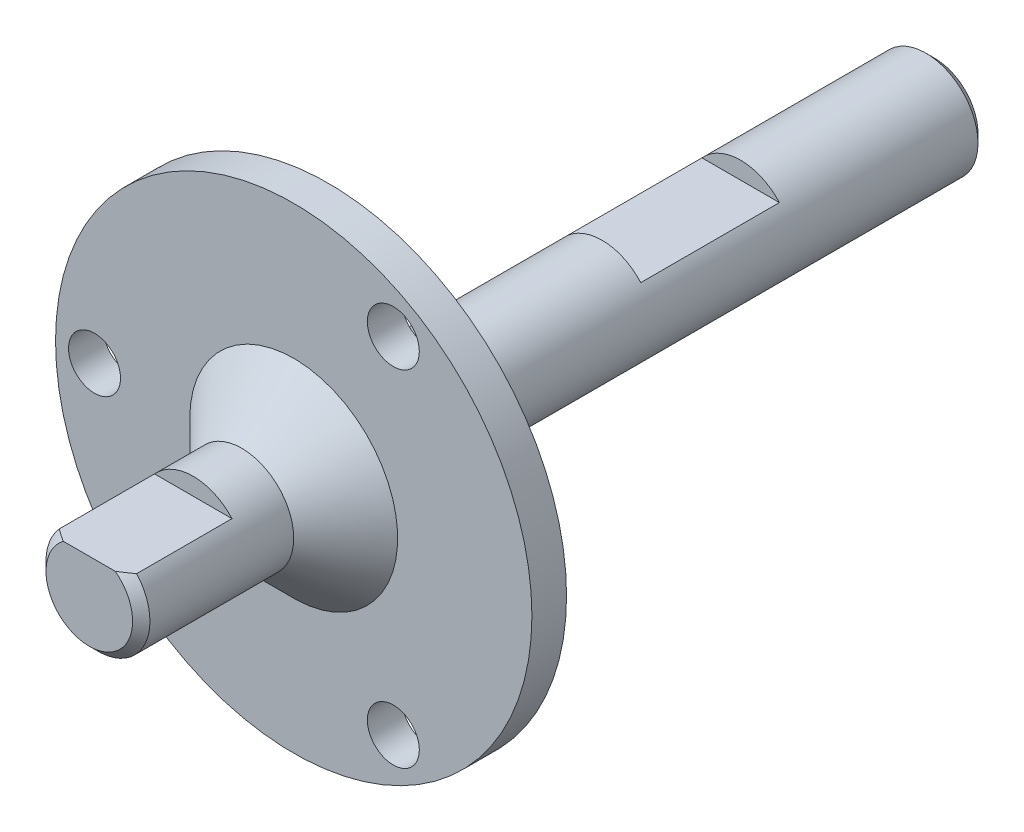
ISO-10303-21;
HEADER;
FILE_DESCRIPTION(('STEP AP214'),'2;1');
FILE_NAME('part.step','',(''),(''),'','','');
FILE_SCHEMA(('AUTOMOTIVE_DESIGN { 1 0 10303 214 1 1 1 1 }'));
ENDSEC;
DATA;
#1=APPLICATION_CONTEXT('core data for automotive mechanical design processes');
#2=APPLICATION_PROTOCOL_DEFINITION('international standard','automotive_design',2000,#1);
#3=PRODUCT_CONTEXT('',#1,'mechanical');
#4=PRODUCT('Part','Part','',(#3));
#5=PRODUCT_RELATED_PRODUCT_CATEGORY('part','',(#4));
#6=PRODUCT_DEFINITION_FORMATION('','',#4);
#7=PRODUCT_DEFINITION_CONTEXT('part definition',#1,'design');
#8=PRODUCT_DEFINITION('design','',#6,#7);
#9=PRODUCT_DEFINITION_SHAPE('','',#8);
#10=(LENGTH_UNIT() NAMED_UNIT(*) SI_UNIT(.MILLI.,.METRE.));
#11=(NAMED_UNIT(*) PLANE_ANGLE_UNIT() SI_UNIT($,.RADIAN.));
#12=(NAMED_UNIT(*) SI_UNIT($,.STERADIAN.) SOLID_ANGLE_UNIT());
#13=UNCERTAINTY_MEASURE_WITH_UNIT(LENGTH_MEASURE(1.E-05),#10,'distance_accuracy_value','');
#14=(GEOMETRIC_REPRESENTATION_CONTEXT(3) GLOBAL_UNCERTAINTY_ASSIGNED_CONTEXT((#13)) GLOBAL_UNIT_ASSIGNED_CONTEXT((#10,
#11,#12)) REPRESENTATION_CONTEXT('',''));
#15=CARTESIAN_POINT('',(0.,0.,0.));
#16=DIRECTION('',(0.,0.,1.));
#17=DIRECTION('',(1.,0.,0.));
#18=AXIS2_PLACEMENT_3D('',#15,#16,#17);
#19=CARTESIAN_POINT('',(0.,0.,0.));
#20=DIRECTION('',(0.,0.,-1.));
#21=DIRECTION('',(-1.,0.,0.));
#22=AXIS2_PLACEMENT_3D('',#19,#20,#21);
#23=PLANE('',#22);
#24=DIRECTION('',(1.,0.,0.));
#25=VECTOR('',#24,1.);
#26=CARTESIAN_POINT('',(-3.,2.,0.));
#27=LINE('',#26,#25);
#28=CARTESIAN_POINT('',(-1.49999999999998,2.,0.));
#29=VERTEX_POINT('',#28);
#30=CARTESIAN_POINT('',(1.49999999999998,2.,0.));
#31=VERTEX_POINT('',#30);
#32=EDGE_CURVE('E201',#29,#31,#27,.T.);
#33=ORIENTED_EDGE('',*,*,#32,.F.);
#34=CARTESIAN_POINT('',(0.,0.,0.));
#35=DIRECTION('',(0.,0.,-1.));
#36=DIRECTION('',(-1.,0.,0.));
#37=AXIS2_PLACEMENT_3D('',#34,#35,#36);
#38=CIRCLE('',#37,2.49999999999999);
#39=EDGE_CURVE('E123',#29,#31,#38,.F.);
#40=ORIENTED_EDGE('',*,*,#39,.T.);
#41=EDGE_LOOP('',(#33,#40));
#42=FACE_BOUND('',#41,.T.);
#43=ADVANCED_FACE('F35',(#42),#23,.F.);
#44=CARTESIAN_POINT('',(0.,0.,33.5409836065574));
#45=DIRECTION('',(0.,0.,1.));
#46=DIRECTION('',(1.,0.,0.));
#47=AXIS2_PLACEMENT_3D('',#44,#45,#46);
#48=CYLINDRICAL_SURFACE('',#47,3.);
#49=CARTESIAN_POINT('',(0.,0.,-8.79999999999999));
#50=DIRECTION('',(0.,0.,-1.));
#51=DIRECTION('',(-1.,0.,0.));
#52=AXIS2_PLACEMENT_3D('',#49,#50,#51);
#53=CIRCLE('',#52,3.);
#54=CARTESIAN_POINT('',(-3.,0.,-8.79999999999999));
#55=VERTEX_POINT('',#54);
#56=EDGE_CURVE('E117',#55,#55,#53,.F.);
#57=ORIENTED_EDGE('',*,*,#56,.T.);
#58=EDGE_LOOP('',(#57));
#59=FACE_BOUND('',#58,.T.);
#60=DIRECTION('',(0.,0.,1.));
#61=VECTOR('',#60,1.);
#62=CARTESIAN_POINT('',(2.23606797749979,2.,33.5409836065574));
#63=LINE('',#62,#61);
#64=CARTESIAN_POINT('',(2.23606797749979,2.,-0.500000000000014));
#65=VERTEX_POINT('',#64);
#66=CARTESIAN_POINT('',(2.23606797749979,2.,-6.));
#67=VERTEX_POINT('',#66);
#68=EDGE_CURVE('E113',#65,#67,#63,.F.);
#69=ORIENTED_EDGE('',*,*,#68,.F.);
#70=CARTESIAN_POINT('',(0.,0.,-0.500000000000014));
#71=DIRECTION('',(0.,0.,-1.));
#72=DIRECTION('',(-1.,0.,0.));
#73=AXIS2_PLACEMENT_3D('',#70,#71,#72);
#74=CIRCLE('',#73,3.);
#75=CARTESIAN_POINT('',(-2.23606797749979,2.,-0.500000000000014));
#76=VERTEX_POINT('',#75);
#77=EDGE_CURVE('E57',#65,#76,#74,.T.);
#78=ORIENTED_EDGE('',*,*,#77,.T.);
#79=DIRECTION('',(0.,0.,1.));
#80=VECTOR('',#79,1.);
#81=CARTESIAN_POINT('',(-2.23606797749979,2.,33.5409836065574));
#82=LINE('',#81,#80);
#83=CARTESIAN_POINT('',(-2.23606797749979,2.,-6.));
#84=VERTEX_POINT('',#83);
#85=EDGE_CURVE('E115',#84,#76,#82,.T.);
#86=ORIENTED_EDGE('',*,*,#85,.F.);
#87=CARTESIAN_POINT('',(0.,0.,-6.));
#88=DIRECTION('',(0.,0.,-1.));
#89=DIRECTION('',(-1.,0.,0.));
#90=AXIS2_PLACEMENT_3D('',#87,#88,#89);
#91=CIRCLE('',#90,3.);
#92=EDGE_CURVE('E94',#84,#67,#91,.T.);
#93=ORIENTED_EDGE('',*,*,#92,.T.);
#94=EDGE_LOOP('',(#69,#78,#86,#93));
#95=FACE_BOUND('',#94,.T.);
#96=ADVANCED_FACE('F167',(#59,#95),#48,.T.);
#97=CARTESIAN_POINT('',(0.,3.,-11.8));
#98=DIRECTION('',(0.,0.,-1.));
#99=DIRECTION('',(-1.,0.,0.));
#100=AXIS2_PLACEMENT_3D('',#97,#98,#99);
#101=PLANE('',#100);
#102=CARTESIAN_POINT('',(5.75,-9.95929214352105,-11.8));
#103=DIRECTION('',(0.,0.,1.));
#104=DIRECTION('',(1.,0.,0.));
#105=AXIS2_PLACEMENT_3D('',#102,#103,#104);
#106=CIRCLE('',#105,1.5);
#107=CARTESIAN_POINT('',(7.25,-9.95929214352105,-11.8));
#108=VERTEX_POINT('',#107);
#109=EDGE_CURVE('E128',#108,#108,#106,.T.);
#110=ORIENTED_EDGE('',*,*,#109,.F.);
#111=EDGE_LOOP('',(#110));
#112=FACE_BOUND('',#111,.T.);
#113=CARTESIAN_POINT('',(-11.5,0.,-11.8));
#114=DIRECTION('',(0.,0.,1.));
#115=DIRECTION('',(1.,0.,0.));
#116=AXIS2_PLACEMENT_3D('',#113,#114,#115);
#117=CIRCLE('',#116,1.5);
#118=CARTESIAN_POINT('',(-10.,0.,-11.8));
#119=VERTEX_POINT('',#118);
#120=EDGE_CURVE('E225',#119,#119,#117,.T.);
#121=ORIENTED_EDGE('',*,*,#120,.F.);
#122=EDGE_LOOP('',(#121));
#123=FACE_BOUND('',#122,.T.);
#124=CARTESIAN_POINT('',(5.75,9.95929214352105,-11.8));
#125=DIRECTION('',(0.,0.,1.));
#126=DIRECTION('',(1.,0.,0.));
#127=AXIS2_PLACEMENT_3D('',#124,#125,#126);
#128=CIRCLE('',#127,1.5);
#129=CARTESIAN_POINT('',(7.25,9.95929214352105,-11.8));
#130=VERTEX_POINT('',#129);
#131=EDGE_CURVE('E222',#130,#130,#128,.T.);
#132=ORIENTED_EDGE('',*,*,#131,.F.);
#133=EDGE_LOOP('',(#132));
#134=FACE_BOUND('',#133,.T.);
#135=CARTESIAN_POINT('',(0.,0.,-11.8));
#136=DIRECTION('',(0.,0.,-1.));
#137=DIRECTION('',(-1.,0.,0.));
#138=AXIS2_PLACEMENT_3D('',#135,#136,#137);
#139=CIRCLE('',#138,5.99999999999998);
#140=CARTESIAN_POINT('',(-5.99999999999998,0.,-11.8));
#141=VERTEX_POINT('',#140);
#142=EDGE_CURVE('E120',#141,#141,#139,.T.);
#143=ORIENTED_EDGE('',*,*,#142,.T.);
#144=EDGE_LOOP('',(#143));
#145=FACE_BOUND('',#144,.T.);
#146=CARTESIAN_POINT('',(0.,0.,-11.8));
#147=DIRECTION('',(0.,0.,1.));
#148=DIRECTION('',(1.,0.,0.));
#149=AXIS2_PLACEMENT_3D('',#146,#147,#148);
#150=CIRCLE('',#149,13.75);
#151=CARTESIAN_POINT('',(13.75,0.,-11.8));
#152=VERTEX_POINT('',#151);
#153=EDGE_CURVE('E107',#152,#152,#150,.T.);
#154=ORIENTED_EDGE('',*,*,#153,.T.);
#155=EDGE_LOOP('',(#154));
#156=FACE_BOUND('',#155,.T.);
#157=ADVANCED_FACE('F171',(#112,#123,#134,#145,#156),#101,.F.);
#158=CARTESIAN_POINT('',(0.,0.,33.5409836065574));
#159=DIRECTION('',(0.,0.,1.));
#160=DIRECTION('',(1.,0.,0.));
#161=AXIS2_PLACEMENT_3D('',#158,#159,#160);
#162=CYLINDRICAL_SURFACE('',#161,13.75);
#163=ORIENTED_EDGE('',*,*,#153,.F.);
#164=EDGE_LOOP('',(#163));
#165=FACE_BOUND('',#164,.T.);
#166=CARTESIAN_POINT('',(0.,0.,-13.8));
#167=DIRECTION('',(0.,0.,1.));
#168=DIRECTION('',(1.,0.,0.));
#169=AXIS2_PLACEMENT_3D('',#166,#167,#168);
#170=CIRCLE('',#169,13.75);
#171=CARTESIAN_POINT('',(13.75,0.,-13.8));
#172=VERTEX_POINT('',#171);
#173=EDGE_CURVE('E211',#172,#172,#170,.T.);
#174=ORIENTED_EDGE('',*,*,#173,.T.);
#175=EDGE_LOOP('',(#174));
#176=FACE_BOUND('',#175,.T.);
#177=ADVANCED_FACE('F175',(#165,#176),#162,.T.);
#178=CARTESIAN_POINT('',(0.,13.75,-13.8));
#179=DIRECTION('',(0.,0.,1.));
#180=DIRECTION('',(1.,0.,0.));
#181=AXIS2_PLACEMENT_3D('',#178,#179,#180);
#182=PLANE('',#181);
#183=CARTESIAN_POINT('',(5.75,-9.95929214352105,-13.8));
#184=DIRECTION('',(0.,0.,1.));
#185=DIRECTION('',(1.,0.,0.));
#186=AXIS2_PLACEMENT_3D('',#183,#184,#185);
#187=CIRCLE('',#186,1.5);
#188=CARTESIAN_POINT('',(7.25,-9.95929214352105,-13.8));
#189=VERTEX_POINT('',#188);
#190=EDGE_CURVE('E131',#189,#189,#187,.T.);
#191=ORIENTED_EDGE('',*,*,#190,.T.);
#192=EDGE_LOOP('',(#191));
#193=FACE_BOUND('',#192,.T.);
#194=CARTESIAN_POINT('',(-11.5,0.,-13.8));
#195=DIRECTION('',(0.,0.,1.));
#196=DIRECTION('',(1.,0.,0.));
#197=AXIS2_PLACEMENT_3D('',#194,#195,#196);
#198=CIRCLE('',#197,1.5);
#199=CARTESIAN_POINT('',(-10.,0.,-13.8));
#200=VERTEX_POINT('',#199);
#201=EDGE_CURVE('E127',#200,#200,#198,.T.);
#202=ORIENTED_EDGE('',*,*,#201,.T.);
#203=EDGE_LOOP('',(#202));
#204=FACE_BOUND('',#203,.T.);
#205=CARTESIAN_POINT('',(5.75,9.95929214352105,-13.8));
#206=DIRECTION('',(0.,0.,1.));
#207=DIRECTION('',(1.,0.,0.));
#208=AXIS2_PLACEMENT_3D('',#205,#206,#207);
#209=CIRCLE('',#208,1.5);
#210=CARTESIAN_POINT('',(7.25,9.95929214352105,-13.8));
#211=VERTEX_POINT('',#210);
#212=EDGE_CURVE('E124',#211,#211,#209,.T.);
#213=ORIENTED_EDGE('',*,*,#212,.T.);
#214=EDGE_LOOP('',(#213));
#215=FACE_BOUND('',#214,.T.);
#216=ORIENTED_EDGE('',*,*,#173,.F.);
#217=EDGE_LOOP('',(#216));
#218=FACE_BOUND('',#217,.T.);
#219=CARTESIAN_POINT('',(0.,0.,-13.8));
#220=DIRECTION('',(0.,0.,1.));
#221=DIRECTION('',(1.,0.,0.));
#222=AXIS2_PLACEMENT_3D('',#219,#220,#221);
#223=CIRCLE('',#222,3.);
#224=CARTESIAN_POINT('',(3.,0.,-13.8));
#225=VERTEX_POINT('',#224);
#226=EDGE_CURVE('E100',#225,#225,#223,.T.);
#227=ORIENTED_EDGE('',*,*,#226,.T.);
#228=EDGE_LOOP('',(#227));
#229=FACE_BOUND('',#228,.T.);
#230=ADVANCED_FACE('F179',(#193,#204,#215,#218,#229),#182,.F.);
#231=CARTESIAN_POINT('',(0.,0.,33.5409836065574));
#232=DIRECTION('',(0.,0.,1.));
#233=DIRECTION('',(1.,0.,0.));
#234=AXIS2_PLACEMENT_3D('',#231,#232,#233);
#235=CYLINDRICAL_SURFACE('',#234,3.);
#236=CARTESIAN_POINT('',(0.,0.,-48.3));
#237=DIRECTION('',(0.,0.,1.));
#238=DIRECTION('',(1.,0.,0.));
#239=AXIS2_PLACEMENT_3D('',#236,#237,#238);
#240=CIRCLE('',#239,3.);
#241=CARTESIAN_POINT('',(3.,0.,-48.3));
#242=VERTEX_POINT('',#241);
#243=EDGE_CURVE('E43',#242,#242,#240,.T.);
#244=ORIENTED_EDGE('',*,*,#243,.T.);
#245=EDGE_LOOP('',(#244));
#246=FACE_BOUND('',#245,.T.);
#247=DIRECTION('',(0.,0.,1.));
#248=VECTOR('',#247,1.);
#249=CARTESIAN_POINT('',(2.23606797749979,2.,33.5409836065574));
#250=LINE('',#249,#248);
#251=CARTESIAN_POINT('',(2.23606797749979,2.,-29.6));
#252=VERTEX_POINT('',#251);
#253=CARTESIAN_POINT('',(2.23606797749979,2.,-37.6));
#254=VERTEX_POINT('',#253);
#255=EDGE_CURVE('E95',#252,#254,#250,.F.);
#256=ORIENTED_EDGE('',*,*,#255,.F.);
#257=CARTESIAN_POINT('',(0.,0.,-29.6));
#258=DIRECTION('',(0.,0.,1.));
#259=DIRECTION('',(1.,0.,0.));
#260=AXIS2_PLACEMENT_3D('',#257,#258,#259);
#261=CIRCLE('',#260,3.);
#262=CARTESIAN_POINT('',(-2.23606797749979,2.,-29.6));
#263=VERTEX_POINT('',#262);
#264=EDGE_CURVE('E99',#252,#263,#261,.T.);
#265=ORIENTED_EDGE('',*,*,#264,.T.);
#266=DIRECTION('',(0.,0.,1.));
#267=VECTOR('',#266,1.);
#268=CARTESIAN_POINT('',(-2.23606797749979,2.,33.5409836065574));
#269=LINE('',#268,#267);
#270=CARTESIAN_POINT('',(-2.23606797749979,2.,-37.6));
#271=VERTEX_POINT('',#270);
#272=EDGE_CURVE('E84',#271,#263,#269,.T.);
#273=ORIENTED_EDGE('',*,*,#272,.F.);
#274=CARTESIAN_POINT('',(0.,0.,-37.6));
#275=DIRECTION('',(0.,0.,-1.));
#276=DIRECTION('',(-1.,0.,0.));
#277=AXIS2_PLACEMENT_3D('',#274,#275,#276);
#278=CIRCLE('',#277,3.);
#279=EDGE_CURVE('E104',#271,#254,#278,.T.);
#280=ORIENTED_EDGE('',*,*,#279,.T.);
#281=EDGE_LOOP('',(#256,#265,#273,#280));
#282=FACE_BOUND('',#281,.T.);
#283=ORIENTED_EDGE('',*,*,#226,.F.);
#284=EDGE_LOOP('',(#283));
#285=FACE_BOUND('',#284,.T.);
#286=ADVANCED_FACE('F102',(#246,#282,#285),#235,.T.);
#287=CARTESIAN_POINT('',(0.,3.,-48.8));
#288=DIRECTION('',(0.,0.,1.));
#289=DIRECTION('',(1.,0.,0.));
#290=AXIS2_PLACEMENT_3D('',#287,#288,#289);
#291=PLANE('',#290);
#292=CARTESIAN_POINT('',(0.,0.,-48.8));
#293=DIRECTION('',(0.,0.,1.));
#294=DIRECTION('',(1.,0.,0.));
#295=AXIS2_PLACEMENT_3D('',#292,#293,#294);
#296=CIRCLE('',#295,2.5);
#297=CARTESIAN_POINT('',(2.5,0.,-48.8));
#298=VERTEX_POINT('',#297);
#299=EDGE_CURVE('E11',#298,#298,#296,.F.);
#300=ORIENTED_EDGE('',*,*,#299,.T.);
#301=EDGE_LOOP('',(#300));
#302=FACE_BOUND('',#301,.T.);
#303=ADVANCED_FACE('F186',(#302),#291,.F.);
#304=CARTESIAN_POINT('',(-3.00000000000001,2.,-29.6));
#305=DIRECTION('',(0.,0.,1.));
#306=DIRECTION('',(1.,0.,0.));
#307=AXIS2_PLACEMENT_3D('',#304,#305,#306);
#308=PLANE('',#307);
#309=DIRECTION('',(1.,0.,0.));
#310=VECTOR('',#309,1.);
#311=CARTESIAN_POINT('',(-3.00000000000001,2.,-29.6));
#312=LINE('',#311,#310);
#313=EDGE_CURVE('E87',#263,#252,#312,.T.);
#314=ORIENTED_EDGE('',*,*,#313,.F.);
#315=ORIENTED_EDGE('',*,*,#264,.F.);
#316=EDGE_LOOP('',(#314,#315));
#317=FACE_BOUND('',#316,.T.);
#318=ADVANCED_FACE('F98',(#317),#308,.F.);
#319=CARTESIAN_POINT('',(-3.00000000000001,2.,-37.6));
#320=DIRECTION('',(0.,0.,-1.));
#321=DIRECTION('',(-1.,0.,0.));
#322=AXIS2_PLACEMENT_3D('',#319,#320,#321);
#323=PLANE('',#322);
#324=DIRECTION('',(-1.,0.,0.));
#325=VECTOR('',#324,1.);
#326=CARTESIAN_POINT('',(-3.00000000000001,2.,-37.6));
#327=LINE('',#326,#325);
#328=EDGE_CURVE('E90',#254,#271,#327,.T.);
#329=ORIENTED_EDGE('',*,*,#328,.F.);
#330=ORIENTED_EDGE('',*,*,#279,.F.);
#331=EDGE_LOOP('',(#329,#330));
#332=FACE_BOUND('',#331,.T.);
#333=ADVANCED_FACE('F197',(#332),#323,.F.);
#334=CARTESIAN_POINT('',(0.,2.,0.));
#335=DIRECTION('',(0.,1.,0.));
#336=DIRECTION('',(0.,0.,1.));
#337=AXIS2_PLACEMENT_3D('',#334,#335,#336);
#338=PLANE('',#337);
#339=ORIENTED_EDGE('',*,*,#272,.T.);
#340=ORIENTED_EDGE('',*,*,#313,.T.);
#341=ORIENTED_EDGE('',*,*,#255,.T.);
#342=ORIENTED_EDGE('',*,*,#328,.T.);
#343=EDGE_LOOP('',(#339,#340,#341,#342));
#344=FACE_BOUND('',#343,.T.);
#345=ADVANCED_FACE('F86',(#344),#338,.T.);
#346=CARTESIAN_POINT('',(-3.,2.,-6.));
#347=DIRECTION('',(0.,0.,-1.));
#348=DIRECTION('',(-1.,0.,0.));
#349=AXIS2_PLACEMENT_3D('',#346,#347,#348);
#350=PLANE('',#349);
#351=DIRECTION('',(-1.,0.,0.));
#352=VECTOR('',#351,1.);
#353=CARTESIAN_POINT('',(-3.,2.,-6.));
#354=LINE('',#353,#352);
#355=EDGE_CURVE('E134',#67,#84,#354,.T.);
#356=ORIENTED_EDGE('',*,*,#355,.F.);
#357=ORIENTED_EDGE('',*,*,#92,.F.);
#358=EDGE_LOOP('',(#356,#357));
#359=FACE_BOUND('',#358,.T.);
#360=ADVANCED_FACE('F190',(#359),#350,.F.);
#361=CARTESIAN_POINT('',(0.,2.,0.));
#362=DIRECTION('',(0.,1.,0.));
#363=DIRECTION('',(0.,0.,1.));
#364=AXIS2_PLACEMENT_3D('',#361,#362,#363);
#365=PLANE('',#364);
#366=ORIENTED_EDGE('',*,*,#32,.T.);
#367=CARTESIAN_POINT('',(1.49999999999998,2.,0.));
#368=CARTESIAN_POINT('',(1.56363441041134,2.,-0.038200677857323));
#369=CARTESIAN_POINT('',(1.62658889898814,2.,-0.0775079640651554));
#370=CARTESIAN_POINT('',(1.75127191097624,2.,-0.157942702576662));
#371=CARTESIAN_POINT('',(1.81300116191586,2.,-0.199069024887969));
#372=CARTESIAN_POINT('',(1.93543485253752,2.,-0.2827894695487));
#373=CARTESIAN_POINT('',(1.99613946258491,2.,-0.32538334423652));
#374=CARTESIAN_POINT('',(2.11670900846293,2.,-0.411821773696666));
#375=CARTESIAN_POINT('',(2.17657340830976,2.,-0.455667077101278));
#376=CARTESIAN_POINT('',(2.23606797749979,2.,-0.500000000000014));
#377=B_SPLINE_CURVE_WITH_KNOTS('',3,(#367,#368,#369,#370,#371,#372,#373,#374,#375,#376),
.UNSPECIFIED.,.F.,.F.,(4,2,2,2,4),(0.,0.22262990192215,0.445123396049351,0.667579524717586,
0.890171642368397),.UNSPECIFIED.);
#378=EDGE_CURVE('E50',#31,#65,#377,.T.);
#379=ORIENTED_EDGE('',*,*,#378,.T.);
#380=ORIENTED_EDGE('',*,*,#68,.T.);
#381=ORIENTED_EDGE('',*,*,#355,.T.);
#382=ORIENTED_EDGE('',*,*,#85,.T.);
#383=CARTESIAN_POINT('',(-2.23606797749979,2.,-0.500000000000014));
#384=CARTESIAN_POINT('',(-2.17657340830977,2.,-0.455667077101278));
#385=CARTESIAN_POINT('',(-2.11670900846293,2.,-0.411821773696666));
#386=CARTESIAN_POINT('',(-1.99613946258491,2.,-0.32538334423652));
#387=CARTESIAN_POINT('',(-1.93543485253752,2.,-0.2827894695487));
#388=CARTESIAN_POINT('',(-1.81300116191586,2.,-0.199069024887969));
#389=CARTESIAN_POINT('',(-1.75127191097624,2.,-0.157942702576662));
#390=CARTESIAN_POINT('',(-1.62658889898814,2.,-0.0775079640651554));
#391=CARTESIAN_POINT('',(-1.56363441041134,2.,-0.0382006778573229));
#392=CARTESIAN_POINT('',(-1.49999999999998,2.,0.));
#393=B_SPLINE_CURVE_WITH_KNOTS('',3,(#383,#384,#385,#386,#387,#388,#389,#390,#391,#392),
.UNSPECIFIED.,.F.,.F.,(4,2,2,2,4),(0.,0.222592117650812,0.445048246319048,0.667541740446248,
0.890171642368398),.UNSPECIFIED.);
#394=EDGE_CURVE('E137',#76,#29,#393,.T.);
#395=ORIENTED_EDGE('',*,*,#394,.T.);
#396=EDGE_LOOP('',(#366,#379,#380,#381,#382,#395));
#397=FACE_BOUND('',#396,.T.);
#398=ADVANCED_FACE('F149',(#397),#365,.T.);
#399=CARTESIAN_POINT('',(0.,0.,-8.79999999999999));
#400=DIRECTION('',(0.,0.,-1.));
#401=DIRECTION('',(-1.,0.,0.));
#402=AXIS2_PLACEMENT_3D('',#399,#400,#401);
#403=CONICAL_SURFACE('',#402,3.,0.785398163397443);
#404=ORIENTED_EDGE('',*,*,#142,.F.);
#405=EDGE_LOOP('',(#404));
#406=FACE_BOUND('',#405,.T.);
#407=ORIENTED_EDGE('',*,*,#56,.F.);
#408=EDGE_LOOP('',(#407));
#409=FACE_BOUND('',#408,.T.);
#410=ADVANCED_FACE('F159',(#406,#409),#403,.T.);
#411=CARTESIAN_POINT('',(5.75,9.95929214352105,-48.8));
#412=DIRECTION('',(0.,0.,1.));
#413=DIRECTION('',(1.,0.,0.));
#414=AXIS2_PLACEMENT_3D('',#411,#412,#413);
#415=CYLINDRICAL_SURFACE('',#414,1.5);
#416=ORIENTED_EDGE('',*,*,#131,.T.);
#417=EDGE_LOOP('',(#416));
#418=FACE_BOUND('',#417,.T.);
#419=ORIENTED_EDGE('',*,*,#212,.F.);
#420=EDGE_LOOP('',(#419));
#421=FACE_BOUND('',#420,.T.);
#422=ADVANCED_FACE('F163',(#418,#421),#415,.F.);
#423=CARTESIAN_POINT('',(-11.5,0.,-48.8));
#424=DIRECTION('',(0.,0.,1.));
#425=DIRECTION('',(1.,0.,0.));
#426=AXIS2_PLACEMENT_3D('',#423,#424,#425);
#427=CYLINDRICAL_SURFACE('',#426,1.5);
#428=ORIENTED_EDGE('',*,*,#120,.T.);
#429=EDGE_LOOP('',(#428));
#430=FACE_BOUND('',#429,.T.);
#431=ORIENTED_EDGE('',*,*,#201,.F.);
#432=EDGE_LOOP('',(#431));
#433=FACE_BOUND('',#432,.T.);
#434=ADVANCED_FACE('F243',(#430,#433),#427,.F.);
#435=CARTESIAN_POINT('',(5.75,-9.95929214352105,-48.8));
#436=DIRECTION('',(0.,0.,1.));
#437=DIRECTION('',(1.,0.,0.));
#438=AXIS2_PLACEMENT_3D('',#435,#436,#437);
#439=CYLINDRICAL_SURFACE('',#438,1.5);
#440=ORIENTED_EDGE('',*,*,#109,.T.);
#441=EDGE_LOOP('',(#440));
#442=FACE_BOUND('',#441,.T.);
#443=ORIENTED_EDGE('',*,*,#190,.F.);
#444=EDGE_LOOP('',(#443));
#445=FACE_BOUND('',#444,.T.);
#446=ADVANCED_FACE('F157',(#442,#445),#439,.F.);
#447=CARTESIAN_POINT('',(0.,0.,0.));
#448=DIRECTION('',(0.,0.,-1.));
#449=DIRECTION('',(-1.,0.,0.));
#450=AXIS2_PLACEMENT_3D('',#447,#448,#449);
#451=CONICAL_SURFACE('',#450,2.49999999999999,0.785398163397446);
#452=ORIENTED_EDGE('',*,*,#394,.F.);
#453=ORIENTED_EDGE('',*,*,#77,.F.);
#454=ORIENTED_EDGE('',*,*,#378,.F.);
#455=ORIENTED_EDGE('',*,*,#39,.F.);
#456=EDGE_LOOP('',(#452,#453,#454,#455));
#457=FACE_BOUND('',#456,.T.);
#458=ADVANCED_FACE('F153',(#457),#451,.T.);
#459=CARTESIAN_POINT('',(0.,0.,-48.3));
#460=DIRECTION('',(0.,0.,1.));
#461=DIRECTION('',(1.,0.,0.));
#462=AXIS2_PLACEMENT_3D('',#459,#460,#461);
#463=CONICAL_SURFACE('',#462,3.,0.785398163397438);
#464=ORIENTED_EDGE('',*,*,#299,.F.);
#465=EDGE_LOOP('',(#464));
#466=FACE_BOUND('',#465,.T.);
#467=ORIENTED_EDGE('',*,*,#243,.F.);
#468=EDGE_LOOP('',(#467));
#469=FACE_BOUND('',#468,.T.);
#470=ADVANCED_FACE('F37',(#466,#469),#463,.T.);
#471=CLOSED_SHELL('',(#43,#96,#157,#177,#230,#286,#303,#318,#333,#345,#360,#398,#410,#422,#434,
#446,#458,#470));
#472=MANIFOLD_SOLID_BREP('B2',#471);
#473=ADVANCED_BREP_SHAPE_REPRESENTATION('',(#18,#472),#14);
#474=SHAPE_DEFINITION_REPRESENTATION(#9,#473);
ENDSEC;
END-ISO-10303-21;
